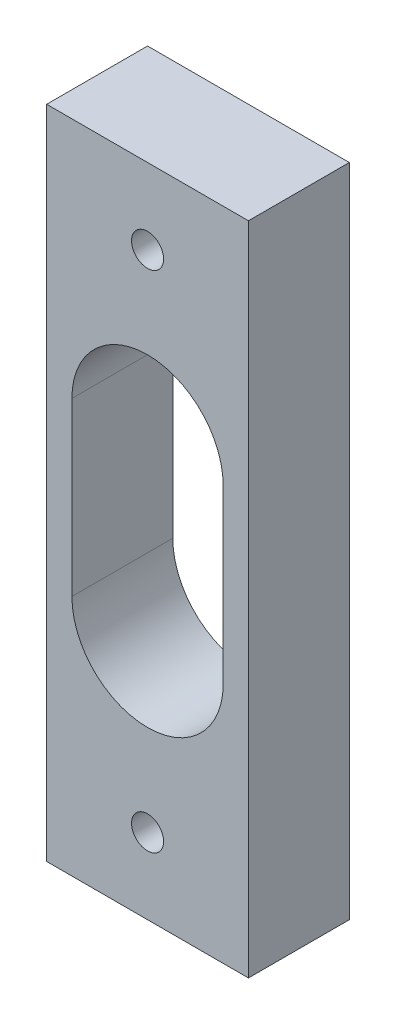
ISO-10303-21;
HEADER;
FILE_DESCRIPTION(('STEP AP214'),'2;1');
FILE_NAME('part.step','',(''),(''),'','','');
FILE_SCHEMA(('AUTOMOTIVE_DESIGN { 1 0 10303 214 1 1 1 1 }'));
ENDSEC;
DATA;
#1=APPLICATION_CONTEXT('core data for automotive mechanical design processes');
#2=APPLICATION_PROTOCOL_DEFINITION('international standard','automotive_design',2000,#1);
#3=PRODUCT_CONTEXT('',#1,'mechanical');
#4=PRODUCT('Part','Part','',(#3));
#5=PRODUCT_RELATED_PRODUCT_CATEGORY('part','',(#4));
#6=PRODUCT_DEFINITION_FORMATION('','',#4);
#7=PRODUCT_DEFINITION_CONTEXT('part definition',#1,'design');
#8=PRODUCT_DEFINITION('design','',#6,#7);
#9=PRODUCT_DEFINITION_SHAPE('','',#8);
#10=(LENGTH_UNIT() NAMED_UNIT(*) SI_UNIT(.MILLI.,.METRE.));
#11=(NAMED_UNIT(*) PLANE_ANGLE_UNIT() SI_UNIT($,.RADIAN.));
#12=(NAMED_UNIT(*) SI_UNIT($,.STERADIAN.) SOLID_ANGLE_UNIT());
#13=UNCERTAINTY_MEASURE_WITH_UNIT(LENGTH_MEASURE(1.E-05),#10,'distance_accuracy_value','');
#14=(GEOMETRIC_REPRESENTATION_CONTEXT(3) GLOBAL_UNCERTAINTY_ASSIGNED_CONTEXT((#13)) GLOBAL_UNIT_ASSIGNED_CONTEXT((#10,
#11,#12)) REPRESENTATION_CONTEXT('',''));
#15=CARTESIAN_POINT('',(0.,0.,0.));
#16=DIRECTION('',(0.,0.,1.));
#17=DIRECTION('',(1.,0.,0.));
#18=AXIS2_PLACEMENT_3D('',#15,#16,#17);
#19=CARTESIAN_POINT('',(0.,82.55,0.));
#20=DIRECTION('',(0.,0.,-1.));
#21=DIRECTION('',(-1.,0.,0.));
#22=AXIS2_PLACEMENT_3D('',#19,#20,#21);
#23=PLANE('',#22);
#24=DIRECTION('',(0.,-1.,0.));
#25=VECTOR('',#24,1.);
#26=CARTESIAN_POINT('',(22.225,30.48,0.));
#27=LINE('',#26,#25);
#28=CARTESIAN_POINT('',(22.225,52.07,0.));
#29=VERTEX_POINT('',#28);
#30=CARTESIAN_POINT('',(22.225,30.48,0.));
#31=VERTEX_POINT('',#30);
#32=EDGE_CURVE('E127',#29,#31,#27,.T.);
#33=ORIENTED_EDGE('',*,*,#32,.T.);
#34=CARTESIAN_POINT('',(12.7,30.48,0.));
#35=DIRECTION('',(0.,0.,-1.));
#36=DIRECTION('',(-1.,0.,0.));
#37=AXIS2_PLACEMENT_3D('',#34,#35,#36);
#38=CIRCLE('',#37,9.52500000000001);
#39=CARTESIAN_POINT('',(3.175,30.48,0.));
#40=VERTEX_POINT('',#39);
#41=EDGE_CURVE('E121',#31,#40,#38,.T.);
#42=ORIENTED_EDGE('',*,*,#41,.T.);
#43=DIRECTION('',(0.,1.,0.));
#44=VECTOR('',#43,1.);
#45=CARTESIAN_POINT('',(3.175,30.48,0.));
#46=LINE('',#45,#44);
#47=CARTESIAN_POINT('',(3.175,52.07,0.));
#48=VERTEX_POINT('',#47);
#49=EDGE_CURVE('E130',#40,#48,#46,.T.);
#50=ORIENTED_EDGE('',*,*,#49,.T.);
#51=CARTESIAN_POINT('',(12.7,52.07,0.));
#52=DIRECTION('',(0.,0.,-1.));
#53=DIRECTION('',(-1.,0.,0.));
#54=AXIS2_PLACEMENT_3D('',#51,#52,#53);
#55=CIRCLE('',#54,9.52500000000001);
#56=EDGE_CURVE('E63',#48,#29,#55,.T.);
#57=ORIENTED_EDGE('',*,*,#56,.T.);
#58=EDGE_LOOP('',(#33,#42,#50,#57));
#59=FACE_BOUND('',#58,.T.);
#60=CARTESIAN_POINT('',(12.7,73.025,0.));
#61=DIRECTION('',(0.,0.,-1.));
#62=DIRECTION('',(-1.,0.,0.));
#63=AXIS2_PLACEMENT_3D('',#60,#61,#62);
#64=CIRCLE('',#63,2.0193);
#65=CARTESIAN_POINT('',(10.6807,73.025,0.));
#66=VERTEX_POINT('',#65);
#67=EDGE_CURVE('E169',#66,#66,#64,.T.);
#68=ORIENTED_EDGE('',*,*,#67,.T.);
#69=EDGE_LOOP('',(#68));
#70=FACE_BOUND('',#69,.T.);
#71=CARTESIAN_POINT('',(12.7,9.52499999999999,0.));
#72=DIRECTION('',(0.,0.,-1.));
#73=DIRECTION('',(-1.,0.,0.));
#74=AXIS2_PLACEMENT_3D('',#71,#72,#73);
#75=CIRCLE('',#74,2.0193);
#76=CARTESIAN_POINT('',(10.6807,9.52499999999999,0.));
#77=VERTEX_POINT('',#76);
#78=EDGE_CURVE('E175',#77,#77,#75,.T.);
#79=ORIENTED_EDGE('',*,*,#78,.T.);
#80=EDGE_LOOP('',(#79));
#81=FACE_BOUND('',#80,.T.);
#82=DIRECTION('',(1.,0.,0.));
#83=VECTOR('',#82,1.);
#84=CARTESIAN_POINT('',(0.,0.,0.));
#85=LINE('',#84,#83);
#86=CARTESIAN_POINT('',(0.,0.,0.));
#87=VERTEX_POINT('',#86);
#88=CARTESIAN_POINT('',(25.4,0.,0.));
#89=VERTEX_POINT('',#88);
#90=EDGE_CURVE('E178',#87,#89,#85,.T.);
#91=ORIENTED_EDGE('',*,*,#90,.T.);
#92=DIRECTION('',(0.,-1.,0.));
#93=VECTOR('',#92,1.);
#94=CARTESIAN_POINT('',(25.4,82.55,0.));
#95=LINE('',#94,#93);
#96=CARTESIAN_POINT('',(25.4,82.55,0.));
#97=VERTEX_POINT('',#96);
#98=EDGE_CURVE('E11',#97,#89,#95,.T.);
#99=ORIENTED_EDGE('',*,*,#98,.F.);
#100=DIRECTION('',(1.,0.,0.));
#101=VECTOR('',#100,1.);
#102=CARTESIAN_POINT('',(0.,82.55,0.));
#103=LINE('',#102,#101);
#104=CARTESIAN_POINT('',(0.,82.55,0.));
#105=VERTEX_POINT('',#104);
#106=EDGE_CURVE('E179',#105,#97,#103,.T.);
#107=ORIENTED_EDGE('',*,*,#106,.F.);
#108=DIRECTION('',(0.,-1.,0.));
#109=VECTOR('',#108,1.);
#110=CARTESIAN_POINT('',(0.,82.55,0.));
#111=LINE('',#110,#109);
#112=EDGE_CURVE('E189',#105,#87,#111,.T.);
#113=ORIENTED_EDGE('',*,*,#112,.T.);
#114=EDGE_LOOP('',(#91,#99,#107,#113));
#115=FACE_BOUND('',#114,.T.);
#116=ADVANCED_FACE('F49',(#59,#70,#81,#115),#23,.F.);
#117=CARTESIAN_POINT('',(25.4,82.55,0.));
#118=DIRECTION('',(-1.,0.,0.));
#119=DIRECTION('',(0.,0.,1.));
#120=AXIS2_PLACEMENT_3D('',#117,#118,#119);
#121=PLANE('',#120);
#122=DIRECTION('',(0.,0.,-1.));
#123=VECTOR('',#122,1.);
#124=CARTESIAN_POINT('',(25.4,0.,0.));
#125=LINE('',#124,#123);
#126=CARTESIAN_POINT('',(25.4,0.,-12.7));
#127=VERTEX_POINT('',#126);
#128=EDGE_CURVE('E192',#89,#127,#125,.T.);
#129=ORIENTED_EDGE('',*,*,#128,.T.);
#130=DIRECTION('',(0.,-1.,0.));
#131=VECTOR('',#130,1.);
#132=CARTESIAN_POINT('',(25.4,82.55,-12.7));
#133=LINE('',#132,#131);
#134=CARTESIAN_POINT('',(25.4,82.55,-12.7));
#135=VERTEX_POINT('',#134);
#136=EDGE_CURVE('E56',#135,#127,#133,.T.);
#137=ORIENTED_EDGE('',*,*,#136,.F.);
#138=DIRECTION('',(0.,0.,-1.));
#139=VECTOR('',#138,1.);
#140=CARTESIAN_POINT('',(25.4,82.55,0.));
#141=LINE('',#140,#139);
#142=EDGE_CURVE('E182',#97,#135,#141,.T.);
#143=ORIENTED_EDGE('',*,*,#142,.F.);
#144=ORIENTED_EDGE('',*,*,#98,.T.);
#145=EDGE_LOOP('',(#129,#137,#143,#144));
#146=FACE_BOUND('',#145,.T.);
#147=ADVANCED_FACE('F222',(#146),#121,.F.);
#148=CARTESIAN_POINT('',(0.,82.55,-12.7));
#149=DIRECTION('',(0.,0.,1.));
#150=DIRECTION('',(1.,0.,0.));
#151=AXIS2_PLACEMENT_3D('',#148,#149,#150);
#152=PLANE('',#151);
#153=DIRECTION('',(0.,1.,0.));
#154=VECTOR('',#153,1.);
#155=CARTESIAN_POINT('',(3.17499999999999,30.48,-12.7));
#156=LINE('',#155,#154);
#157=CARTESIAN_POINT('',(3.17499999999999,30.48,-12.7));
#158=VERTEX_POINT('',#157);
#159=CARTESIAN_POINT('',(3.175,52.07,-12.7));
#160=VERTEX_POINT('',#159);
#161=EDGE_CURVE('E145',#158,#160,#156,.T.);
#162=ORIENTED_EDGE('',*,*,#161,.F.);
#163=CARTESIAN_POINT('',(12.7,30.48,-12.7));
#164=DIRECTION('',(0.,0.,-1.));
#165=DIRECTION('',(-1.,0.,0.));
#166=AXIS2_PLACEMENT_3D('',#163,#164,#165);
#167=CIRCLE('',#166,9.52500000000001);
#168=CARTESIAN_POINT('',(22.225,30.48,-12.7));
#169=VERTEX_POINT('',#168);
#170=EDGE_CURVE('E71',#169,#158,#167,.T.);
#171=ORIENTED_EDGE('',*,*,#170,.F.);
#172=DIRECTION('',(0.,-1.,0.));
#173=VECTOR('',#172,1.);
#174=CARTESIAN_POINT('',(22.225,30.48,-12.7));
#175=LINE('',#174,#173);
#176=CARTESIAN_POINT('',(22.225,52.07,-12.7));
#177=VERTEX_POINT('',#176);
#178=EDGE_CURVE('E136',#177,#169,#175,.T.);
#179=ORIENTED_EDGE('',*,*,#178,.F.);
#180=CARTESIAN_POINT('',(12.7,52.07,-12.7));
#181=DIRECTION('',(0.,0.,-1.));
#182=DIRECTION('',(-1.,0.,0.));
#183=AXIS2_PLACEMENT_3D('',#180,#181,#182);
#184=CIRCLE('',#183,9.52500000000001);
#185=EDGE_CURVE('E139',#160,#177,#184,.T.);
#186=ORIENTED_EDGE('',*,*,#185,.F.);
#187=EDGE_LOOP('',(#162,#171,#179,#186));
#188=FACE_BOUND('',#187,.T.);
#189=CARTESIAN_POINT('',(12.7,73.025,-12.7));
#190=DIRECTION('',(0.,0.,-1.));
#191=DIRECTION('',(-1.,0.,0.));
#192=AXIS2_PLACEMENT_3D('',#189,#190,#191);
#193=CIRCLE('',#192,2.01929999999999);
#194=CARTESIAN_POINT('',(10.6807,73.025,-12.7));
#195=VERTEX_POINT('',#194);
#196=EDGE_CURVE('E166',#195,#195,#193,.T.);
#197=ORIENTED_EDGE('',*,*,#196,.F.);
#198=EDGE_LOOP('',(#197));
#199=FACE_BOUND('',#198,.T.);
#200=CARTESIAN_POINT('',(12.7,9.52499999999999,-12.7));
#201=DIRECTION('',(0.,0.,-1.));
#202=DIRECTION('',(-1.,0.,0.));
#203=AXIS2_PLACEMENT_3D('',#200,#201,#202);
#204=CIRCLE('',#203,2.01929999999999);
#205=CARTESIAN_POINT('',(10.6807,9.52499999999999,-12.7));
#206=VERTEX_POINT('',#205);
#207=EDGE_CURVE('E172',#206,#206,#204,.T.);
#208=ORIENTED_EDGE('',*,*,#207,.F.);
#209=EDGE_LOOP('',(#208));
#210=FACE_BOUND('',#209,.T.);
#211=DIRECTION('',(-1.,0.,0.));
#212=VECTOR('',#211,1.);
#213=CARTESIAN_POINT('',(0.,0.,-12.7));
#214=LINE('',#213,#212);
#215=CARTESIAN_POINT('',(0.,0.,-12.7));
#216=VERTEX_POINT('',#215);
#217=EDGE_CURVE('E194',#127,#216,#214,.T.);
#218=ORIENTED_EDGE('',*,*,#217,.T.);
#219=DIRECTION('',(0.,-1.,0.));
#220=VECTOR('',#219,1.);
#221=CARTESIAN_POINT('',(0.,82.55,-12.7));
#222=LINE('',#221,#220);
#223=CARTESIAN_POINT('',(0.,82.55,-12.7));
#224=VERTEX_POINT('',#223);
#225=EDGE_CURVE('E199',#224,#216,#222,.T.);
#226=ORIENTED_EDGE('',*,*,#225,.F.);
#227=DIRECTION('',(-1.,0.,0.));
#228=VECTOR('',#227,1.);
#229=CARTESIAN_POINT('',(0.,82.55,-12.7));
#230=LINE('',#229,#228);
#231=EDGE_CURVE('E185',#135,#224,#230,.T.);
#232=ORIENTED_EDGE('',*,*,#231,.F.);
#233=ORIENTED_EDGE('',*,*,#136,.T.);
#234=EDGE_LOOP('',(#218,#226,#232,#233));
#235=FACE_BOUND('',#234,.T.);
#236=ADVANCED_FACE('F206',(#188,#199,#210,#235),#152,.F.);
#237=CARTESIAN_POINT('',(0.,82.55,0.));
#238=DIRECTION('',(1.,0.,0.));
#239=DIRECTION('',(0.,0.,-1.));
#240=AXIS2_PLACEMENT_3D('',#237,#238,#239);
#241=PLANE('',#240);
#242=CARTESIAN_POINT('',(0.,19.05,-6.35));
#243=DIRECTION('',(-1.,0.,0.));
#244=DIRECTION('',(0.,0.,1.));
#245=AXIS2_PLACEMENT_3D('',#242,#243,#244);
#246=CIRCLE('',#245,1.72719999999999);
#247=CARTESIAN_POINT('',(0.,19.05,-4.62280000000001));
#248=VERTEX_POINT('',#247);
#249=EDGE_CURVE('E151',#248,#248,#246,.T.);
#250=ORIENTED_EDGE('',*,*,#249,.F.);
#251=EDGE_LOOP('',(#250));
#252=FACE_BOUND('',#251,.T.);
#253=CARTESIAN_POINT('',(0.,63.5,-6.35000000000001));
#254=DIRECTION('',(-1.,0.,0.));
#255=DIRECTION('',(0.,0.,1.));
#256=AXIS2_PLACEMENT_3D('',#253,#254,#255);
#257=CIRCLE('',#256,1.72719999999998);
#258=CARTESIAN_POINT('',(0.,63.5,-4.62280000000003));
#259=VERTEX_POINT('',#258);
#260=EDGE_CURVE('E160',#259,#259,#257,.T.);
#261=ORIENTED_EDGE('',*,*,#260,.F.);
#262=EDGE_LOOP('',(#261));
#263=FACE_BOUND('',#262,.T.);
#264=DIRECTION('',(0.,0.,1.));
#265=VECTOR('',#264,1.);
#266=CARTESIAN_POINT('',(0.,0.,0.));
#267=LINE('',#266,#265);
#268=EDGE_CURVE('E183',#216,#87,#267,.T.);
#269=ORIENTED_EDGE('',*,*,#268,.T.);
#270=ORIENTED_EDGE('',*,*,#112,.F.);
#271=DIRECTION('',(0.,0.,1.));
#272=VECTOR('',#271,1.);
#273=CARTESIAN_POINT('',(0.,82.55,0.));
#274=LINE('',#273,#272);
#275=EDGE_CURVE('E187',#224,#105,#274,.T.);
#276=ORIENTED_EDGE('',*,*,#275,.F.);
#277=ORIENTED_EDGE('',*,*,#225,.T.);
#278=EDGE_LOOP('',(#269,#270,#276,#277));
#279=FACE_BOUND('',#278,.T.);
#280=ADVANCED_FACE('F215',(#252,#263,#279),#241,.F.);
#281=CARTESIAN_POINT('',(0.,82.55,0.));
#282=DIRECTION('',(0.,1.,0.));
#283=DIRECTION('',(0.,0.,1.));
#284=AXIS2_PLACEMENT_3D('',#281,#282,#283);
#285=PLANE('',#284);
#286=ORIENTED_EDGE('',*,*,#106,.T.);
#287=ORIENTED_EDGE('',*,*,#142,.T.);
#288=ORIENTED_EDGE('',*,*,#231,.T.);
#289=ORIENTED_EDGE('',*,*,#275,.T.);
#290=EDGE_LOOP('',(#286,#287,#288,#289));
#291=FACE_BOUND('',#290,.T.);
#292=ADVANCED_FACE('F221',(#291),#285,.T.);
#293=CARTESIAN_POINT('',(0.,0.,0.));
#294=DIRECTION('',(0.,1.,0.));
#295=DIRECTION('',(0.,0.,1.));
#296=AXIS2_PLACEMENT_3D('',#293,#294,#295);
#297=PLANE('',#296);
#298=ORIENTED_EDGE('',*,*,#90,.F.);
#299=ORIENTED_EDGE('',*,*,#268,.F.);
#300=ORIENTED_EDGE('',*,*,#217,.F.);
#301=ORIENTED_EDGE('',*,*,#128,.F.);
#302=EDGE_LOOP('',(#298,#299,#300,#301));
#303=FACE_BOUND('',#302,.T.);
#304=ADVANCED_FACE('F212',(#303),#297,.F.);
#305=CARTESIAN_POINT('',(12.7,9.52499999999999,-12.7));
#306=DIRECTION('',(0.,0.,-1.));
#307=DIRECTION('',(-1.,0.,0.));
#308=AXIS2_PLACEMENT_3D('',#305,#306,#307);
#309=CYLINDRICAL_SURFACE('',#308,2.01929999999999);
#310=ORIENTED_EDGE('',*,*,#78,.F.);
#311=EDGE_LOOP('',(#310));
#312=FACE_BOUND('',#311,.T.);
#313=ORIENTED_EDGE('',*,*,#207,.T.);
#314=EDGE_LOOP('',(#313));
#315=FACE_BOUND('',#314,.T.);
#316=ADVANCED_FACE('F237',(#312,#315),#309,.F.);
#317=CARTESIAN_POINT('',(12.7,73.025,-12.7));
#318=DIRECTION('',(0.,0.,-1.));
#319=DIRECTION('',(-1.,0.,0.));
#320=AXIS2_PLACEMENT_3D('',#317,#318,#319);
#321=CYLINDRICAL_SURFACE('',#320,2.01929999999999);
#322=ORIENTED_EDGE('',*,*,#67,.F.);
#323=EDGE_LOOP('',(#322));
#324=FACE_BOUND('',#323,.T.);
#325=ORIENTED_EDGE('',*,*,#196,.T.);
#326=EDGE_LOOP('',(#325));
#327=FACE_BOUND('',#326,.T.);
#328=ADVANCED_FACE('F241',(#324,#327),#321,.F.);
#329=CARTESIAN_POINT('',(12.2936,63.5,-6.35000000000001));
#330=DIRECTION('',(-1.,0.,0.));
#331=DIRECTION('',(0.,0.,1.));
#332=AXIS2_PLACEMENT_3D('',#329,#330,#331);
#333=CONICAL_SURFACE('',#332,1.7272,1.02974425867665);
#334=CARTESIAN_POINT('',(13.3314064611844,63.5,-6.35000000000001));
#335=VERTEX_POINT('',#334);
#336=VERTEX_LOOP('',#335);
#337=FACE_BOUND('',#336,.T.);
#338=CARTESIAN_POINT('',(12.2936,63.5,-6.35000000000001));
#339=DIRECTION('',(-1.,0.,0.));
#340=DIRECTION('',(0.,0.,1.));
#341=AXIS2_PLACEMENT_3D('',#338,#339,#340);
#342=CIRCLE('',#341,1.7272);
#343=CARTESIAN_POINT('',(12.2936,63.5,-4.62280000000001));
#344=VERTEX_POINT('',#343);
#345=EDGE_CURVE('E163',#344,#344,#342,.T.);
#346=ORIENTED_EDGE('',*,*,#345,.T.);
#347=EDGE_LOOP('',(#346));
#348=FACE_BOUND('',#347,.T.);
#349=ADVANCED_FACE('F245',(#337,#348),#333,.F.);
#350=CARTESIAN_POINT('',(0.,63.5,-6.35000000000001));
#351=DIRECTION('',(-1.,0.,0.));
#352=DIRECTION('',(0.,0.,1.));
#353=AXIS2_PLACEMENT_3D('',#350,#351,#352);
#354=CYLINDRICAL_SURFACE('',#353,1.72719999999999);
#355=ORIENTED_EDGE('',*,*,#345,.F.);
#356=EDGE_LOOP('',(#355));
#357=FACE_BOUND('',#356,.T.);
#358=ORIENTED_EDGE('',*,*,#260,.T.);
#359=EDGE_LOOP('',(#358));
#360=FACE_BOUND('',#359,.T.);
#361=ADVANCED_FACE('F249',(#357,#360),#354,.F.);
#362=CARTESIAN_POINT('',(12.2936,19.05,-6.35));
#363=DIRECTION('',(-1.,0.,0.));
#364=DIRECTION('',(0.,0.,1.));
#365=AXIS2_PLACEMENT_3D('',#362,#363,#364);
#366=CONICAL_SURFACE('',#365,1.72719999999999,1.02974425867665);
#367=CARTESIAN_POINT('',(13.3314064611844,19.05,-6.35));
#368=VERTEX_POINT('',#367);
#369=VERTEX_LOOP('',#368);
#370=FACE_BOUND('',#369,.T.);
#371=CARTESIAN_POINT('',(12.2936,19.05,-6.35));
#372=DIRECTION('',(-1.,0.,0.));
#373=DIRECTION('',(0.,0.,1.));
#374=AXIS2_PLACEMENT_3D('',#371,#372,#373);
#375=CIRCLE('',#374,1.72719999999999);
#376=CARTESIAN_POINT('',(12.2936,19.05,-4.62280000000001));
#377=VERTEX_POINT('',#376);
#378=EDGE_CURVE('E157',#377,#377,#375,.T.);
#379=ORIENTED_EDGE('',*,*,#378,.T.);
#380=EDGE_LOOP('',(#379));
#381=FACE_BOUND('',#380,.T.);
#382=ADVANCED_FACE('F253',(#370,#381),#366,.F.);
#383=CARTESIAN_POINT('',(0.,19.05,-6.35));
#384=DIRECTION('',(-1.,0.,0.));
#385=DIRECTION('',(0.,0.,1.));
#386=AXIS2_PLACEMENT_3D('',#383,#384,#385);
#387=CYLINDRICAL_SURFACE('',#386,1.72719999999999);
#388=ORIENTED_EDGE('',*,*,#378,.F.);
#389=EDGE_LOOP('',(#388));
#390=FACE_BOUND('',#389,.T.);
#391=ORIENTED_EDGE('',*,*,#249,.T.);
#392=EDGE_LOOP('',(#391));
#393=FACE_BOUND('',#392,.T.);
#394=ADVANCED_FACE('F257',(#390,#393),#387,.F.);
#395=CARTESIAN_POINT('',(12.7,30.48,0.));
#396=DIRECTION('',(0.,0.,-1.));
#397=DIRECTION('',(-1.,0.,0.));
#398=AXIS2_PLACEMENT_3D('',#395,#396,#397);
#399=CYLINDRICAL_SURFACE('',#398,9.52500000000001);
#400=ORIENTED_EDGE('',*,*,#170,.T.);
#401=DIRECTION('',(0.,0.,-1.));
#402=VECTOR('',#401,1.);
#403=CARTESIAN_POINT('',(3.175,30.48,0.));
#404=LINE('',#403,#402);
#405=EDGE_CURVE('E117',#40,#158,#404,.T.);
#406=ORIENTED_EDGE('',*,*,#405,.F.);
#407=ORIENTED_EDGE('',*,*,#41,.F.);
#408=DIRECTION('',(0.,0.,-1.));
#409=VECTOR('',#408,1.);
#410=CARTESIAN_POINT('',(22.225,30.48,0.));
#411=LINE('',#410,#409);
#412=EDGE_CURVE('E149',#31,#169,#411,.T.);
#413=ORIENTED_EDGE('',*,*,#412,.T.);
#414=EDGE_LOOP('',(#400,#406,#407,#413));
#415=FACE_BOUND('',#414,.T.);
#416=ADVANCED_FACE('F119',(#415),#399,.F.);
#417=CARTESIAN_POINT('',(22.225,30.48,0.));
#418=DIRECTION('',(1.,0.,0.));
#419=DIRECTION('',(0.,1.,0.));
#420=AXIS2_PLACEMENT_3D('',#417,#418,#419);
#421=PLANE('',#420);
#422=ORIENTED_EDGE('',*,*,#178,.T.);
#423=ORIENTED_EDGE('',*,*,#412,.F.);
#424=ORIENTED_EDGE('',*,*,#32,.F.);
#425=DIRECTION('',(0.,0.,-1.));
#426=VECTOR('',#425,1.);
#427=CARTESIAN_POINT('',(22.225,52.07,0.));
#428=LINE('',#427,#426);
#429=EDGE_CURVE('E152',#29,#177,#428,.T.);
#430=ORIENTED_EDGE('',*,*,#429,.T.);
#431=EDGE_LOOP('',(#422,#423,#424,#430));
#432=FACE_BOUND('',#431,.T.);
#433=ADVANCED_FACE('F264',(#432),#421,.F.);
#434=CARTESIAN_POINT('',(12.7,52.07,0.));
#435=DIRECTION('',(0.,0.,-1.));
#436=DIRECTION('',(-1.,0.,0.));
#437=AXIS2_PLACEMENT_3D('',#434,#435,#436);
#438=CYLINDRICAL_SURFACE('',#437,9.52500000000001);
#439=ORIENTED_EDGE('',*,*,#185,.T.);
#440=ORIENTED_EDGE('',*,*,#429,.F.);
#441=ORIENTED_EDGE('',*,*,#56,.F.);
#442=DIRECTION('',(0.,0.,-1.));
#443=VECTOR('',#442,1.);
#444=CARTESIAN_POINT('',(3.175,52.07,0.));
#445=LINE('',#444,#443);
#446=EDGE_CURVE('E126',#48,#160,#445,.T.);
#447=ORIENTED_EDGE('',*,*,#446,.T.);
#448=EDGE_LOOP('',(#439,#440,#441,#447));
#449=FACE_BOUND('',#448,.T.);
#450=ADVANCED_FACE('F267',(#449),#438,.F.);
#451=CARTESIAN_POINT('',(3.175,30.48,0.));
#452=DIRECTION('',(-1.,0.,0.));
#453=DIRECTION('',(0.,0.,1.));
#454=AXIS2_PLACEMENT_3D('',#451,#452,#453);
#455=PLANE('',#454);
#456=ORIENTED_EDGE('',*,*,#161,.T.);
#457=ORIENTED_EDGE('',*,*,#446,.F.);
#458=ORIENTED_EDGE('',*,*,#49,.F.);
#459=ORIENTED_EDGE('',*,*,#405,.T.);
#460=EDGE_LOOP('',(#456,#457,#458,#459));
#461=FACE_BOUND('',#460,.T.);
#462=ADVANCED_FACE('F131',(#461),#455,.F.);
#463=CLOSED_SHELL('',(#116,#147,#236,#280,#292,#304,#316,#328,#349,#361,#382,#394,#416,#433,
#450,#462));
#464=MANIFOLD_SOLID_BREP('B2',#463);
#465=ADVANCED_BREP_SHAPE_REPRESENTATION('',(#18,#464),#14);
#466=SHAPE_DEFINITION_REPRESENTATION(#9,#465);
ENDSEC;
END-ISO-10303-21;
